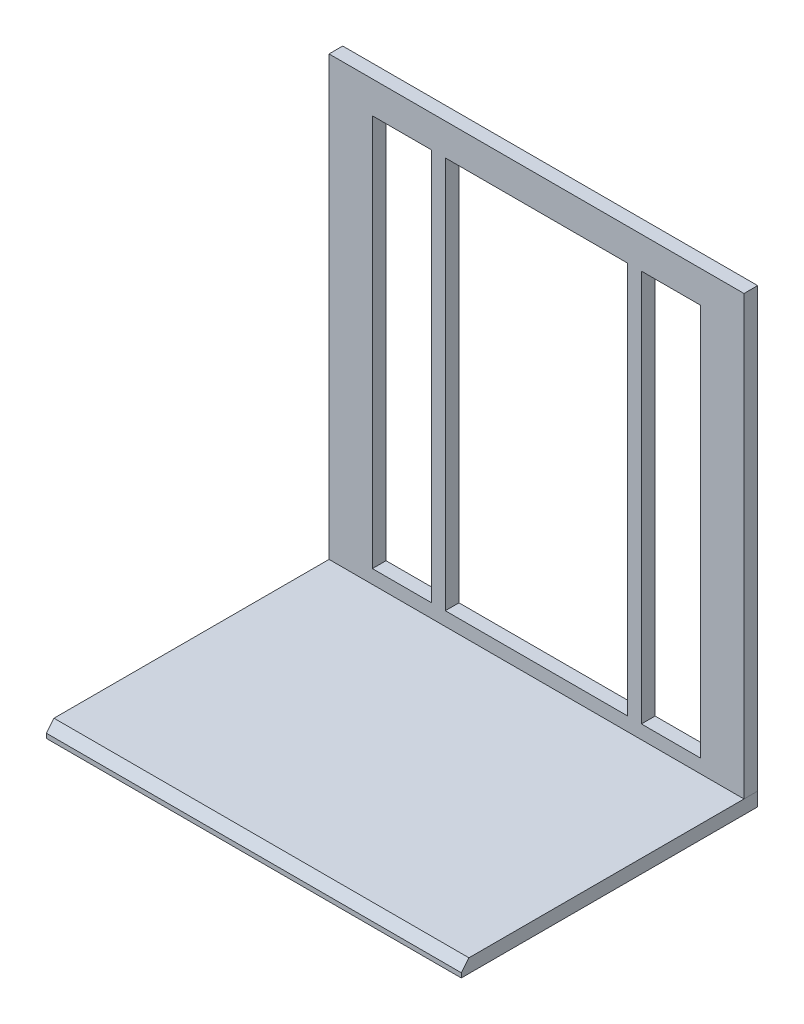
ISO-10303-21;
HEADER;
FILE_DESCRIPTION(('STEP AP214'),'2;1');
FILE_NAME('part.step','',(''),(''),'','','');
FILE_SCHEMA(('AUTOMOTIVE_DESIGN { 1 0 10303 214 1 1 1 1 }'));
ENDSEC;
DATA;
#1=APPLICATION_CONTEXT('core data for automotive mechanical design processes');
#2=APPLICATION_PROTOCOL_DEFINITION('international standard','automotive_design',2000,#1);
#3=PRODUCT_CONTEXT('',#1,'mechanical');
#4=PRODUCT('Part','Part','',(#3));
#5=PRODUCT_RELATED_PRODUCT_CATEGORY('part','',(#4));
#6=PRODUCT_DEFINITION_FORMATION('','',#4);
#7=PRODUCT_DEFINITION_CONTEXT('part definition',#1,'design');
#8=PRODUCT_DEFINITION('design','',#6,#7);
#9=PRODUCT_DEFINITION_SHAPE('','',#8);
#10=(LENGTH_UNIT() NAMED_UNIT(*) SI_UNIT(.MILLI.,.METRE.));
#11=(NAMED_UNIT(*) PLANE_ANGLE_UNIT() SI_UNIT($,.RADIAN.));
#12=(NAMED_UNIT(*) SI_UNIT($,.STERADIAN.) SOLID_ANGLE_UNIT());
#13=UNCERTAINTY_MEASURE_WITH_UNIT(LENGTH_MEASURE(1.E-05),#10,'distance_accuracy_value','');
#14=(GEOMETRIC_REPRESENTATION_CONTEXT(3) GLOBAL_UNCERTAINTY_ASSIGNED_CONTEXT((#13)) GLOBAL_UNIT_ASSIGNED_CONTEXT((#10,
#11,#12)) REPRESENTATION_CONTEXT('',''));
#15=CARTESIAN_POINT('',(0.,0.,0.));
#16=DIRECTION('',(0.,0.,1.));
#17=DIRECTION('',(1.,0.,0.));
#18=AXIS2_PLACEMENT_3D('',#15,#16,#17);
#19=CARTESIAN_POINT('',(-1155.7,-1168.4,1651.));
#20=DIRECTION('',(-1.,0.,0.));
#21=DIRECTION('',(0.,0.,1.));
#22=AXIS2_PLACEMENT_3D('',#19,#20,#21);
#23=PLANE('',#22);
#24=DIRECTION('',(0.,1.,0.));
#25=VECTOR('',#24,1.);
#26=CARTESIAN_POINT('',(-1155.7,-1168.4,1651.));
#27=LINE('',#26,#25);
#28=CARTESIAN_POINT('',(-1155.7,-1244.6,1651.));
#29=VERTEX_POINT('',#28);
#30=CARTESIAN_POINT('',(-1155.7,-1219.2,1651.));
#31=VERTEX_POINT('',#30);
#32=EDGE_CURVE('E98',#29,#31,#27,.T.);
#33=ORIENTED_EDGE('',*,*,#32,.T.);
#34=DIRECTION('',(0.,-0.766044443118982,0.642787609686535));
#35=VECTOR('',#34,1.);
#36=CARTESIAN_POINT('',(-1155.7,-1189.38933628726,1625.98588307349));
#37=LINE('',#36,#35);
#38=CARTESIAN_POINT('',(-1155.7,-1168.4,1608.37373873619));
#39=VERTEX_POINT('',#38);
#40=EDGE_CURVE('E12',#31,#39,#37,.F.);
#41=ORIENTED_EDGE('',*,*,#40,.T.);
#42=DIRECTION('',(0.,0.,-1.));
#43=VECTOR('',#42,1.);
#44=CARTESIAN_POINT('',(-1155.7,-1168.4,1651.));
#45=LINE('',#44,#43);
#46=CARTESIAN_POINT('',(-1155.7,-1168.4,0.));
#47=VERTEX_POINT('',#46);
#48=EDGE_CURVE('E110',#39,#47,#45,.T.);
#49=ORIENTED_EDGE('',*,*,#48,.T.);
#50=DIRECTION('',(0.,1.,0.));
#51=VECTOR('',#50,1.);
#52=CARTESIAN_POINT('',(-1155.7,-1168.4,0.));
#53=LINE('',#52,#51);
#54=CARTESIAN_POINT('',(-1155.7,-1244.6,0.));
#55=VERTEX_POINT('',#54);
#56=EDGE_CURVE('E115',#55,#47,#53,.T.);
#57=ORIENTED_EDGE('',*,*,#56,.F.);
#58=DIRECTION('',(0.,0.,-1.));
#59=VECTOR('',#58,1.);
#60=CARTESIAN_POINT('',(-1155.7,-1244.6,1651.));
#61=LINE('',#60,#59);
#62=EDGE_CURVE('E106',#29,#55,#61,.T.);
#63=ORIENTED_EDGE('',*,*,#62,.F.);
#64=EDGE_LOOP('',(#33,#41,#49,#57,#63));
#65=FACE_BOUND('',#64,.T.);
#66=ADVANCED_FACE('F47',(#65),#23,.T.);
#67=CARTESIAN_POINT('',(-1155.7,-1244.6,1651.));
#68=DIRECTION('',(0.,-1.,0.));
#69=DIRECTION('',(1.,0.,0.));
#70=AXIS2_PLACEMENT_3D('',#67,#68,#69);
#71=PLANE('',#70);
#72=DIRECTION('',(-1.,0.,0.));
#73=VECTOR('',#72,1.);
#74=CARTESIAN_POINT('',(-1155.7,-1244.6,0.));
#75=LINE('',#74,#73);
#76=CARTESIAN_POINT('',(1155.7,-1244.6,0.));
#77=VERTEX_POINT('',#76);
#78=EDGE_CURVE('E105',#77,#55,#75,.T.);
#79=ORIENTED_EDGE('',*,*,#78,.F.);
#80=DIRECTION('',(0.,0.,-1.));
#81=VECTOR('',#80,1.);
#82=CARTESIAN_POINT('',(1155.7,-1244.6,1651.));
#83=LINE('',#82,#81);
#84=CARTESIAN_POINT('',(1155.7,-1244.6,1651.));
#85=VERTEX_POINT('',#84);
#86=EDGE_CURVE('E94',#85,#77,#83,.T.);
#87=ORIENTED_EDGE('',*,*,#86,.F.);
#88=DIRECTION('',(-1.,0.,0.));
#89=VECTOR('',#88,1.);
#90=CARTESIAN_POINT('',(-1155.7,-1244.6,1651.));
#91=LINE('',#90,#89);
#92=EDGE_CURVE('E97',#85,#29,#91,.T.);
#93=ORIENTED_EDGE('',*,*,#92,.T.);
#94=ORIENTED_EDGE('',*,*,#62,.T.);
#95=EDGE_LOOP('',(#79,#87,#93,#94));
#96=FACE_BOUND('',#95,.T.);
#97=ADVANCED_FACE('F103',(#96),#71,.T.);
#98=CARTESIAN_POINT('',(1155.7,-1168.4,1651.));
#99=DIRECTION('',(1.,0.,0.));
#100=DIRECTION('',(0.,0.,-1.));
#101=AXIS2_PLACEMENT_3D('',#98,#99,#100);
#102=PLANE('',#101);
#103=DIRECTION('',(0.,0.,-1.));
#104=VECTOR('',#103,1.);
#105=CARTESIAN_POINT('',(1155.7,-1168.4,1651.));
#106=LINE('',#105,#104);
#107=CARTESIAN_POINT('',(1155.7,-1168.4,1608.37373873619));
#108=VERTEX_POINT('',#107);
#109=CARTESIAN_POINT('',(1155.7,-1168.4,0.));
#110=VERTEX_POINT('',#109);
#111=EDGE_CURVE('E107',#108,#110,#106,.T.);
#112=ORIENTED_EDGE('',*,*,#111,.F.);
#113=DIRECTION('',(0.,0.766044443118982,-0.642787609686535));
#114=VECTOR('',#113,1.);
#115=CARTESIAN_POINT('',(1155.7,-1189.38933628726,1625.98588307349));
#116=LINE('',#115,#114);
#117=CARTESIAN_POINT('',(1155.7,-1219.2,1651.));
#118=VERTEX_POINT('',#117);
#119=EDGE_CURVE('E69',#108,#118,#116,.F.);
#120=ORIENTED_EDGE('',*,*,#119,.T.);
#121=DIRECTION('',(0.,-1.,0.));
#122=VECTOR('',#121,1.);
#123=CARTESIAN_POINT('',(1155.7,-1168.4,1651.));
#124=LINE('',#123,#122);
#125=EDGE_CURVE('E90',#118,#85,#124,.T.);
#126=ORIENTED_EDGE('',*,*,#125,.T.);
#127=ORIENTED_EDGE('',*,*,#86,.T.);
#128=DIRECTION('',(0.,-1.,0.));
#129=VECTOR('',#128,1.);
#130=CARTESIAN_POINT('',(1155.7,-1168.4,0.));
#131=LINE('',#130,#129);
#132=EDGE_CURVE('E121',#110,#77,#131,.T.);
#133=ORIENTED_EDGE('',*,*,#132,.F.);
#134=EDGE_LOOP('',(#112,#120,#126,#127,#133));
#135=FACE_BOUND('',#134,.T.);
#136=ADVANCED_FACE('F92',(#135),#102,.T.);
#137=CARTESIAN_POINT('',(-1155.7,-1168.4,1651.));
#138=DIRECTION('',(0.,1.,0.));
#139=DIRECTION('',(-1.,0.,0.));
#140=AXIS2_PLACEMENT_3D('',#137,#138,#139);
#141=PLANE('',#140);
#142=ORIENTED_EDGE('',*,*,#48,.F.);
#143=DIRECTION('',(1.,0.,0.));
#144=VECTOR('',#143,1.);
#145=CARTESIAN_POINT('',(-1155.7,-1168.4,1608.37373873619));
#146=LINE('',#145,#144);
#147=EDGE_CURVE('E124',#39,#108,#146,.T.);
#148=ORIENTED_EDGE('',*,*,#147,.T.);
#149=ORIENTED_EDGE('',*,*,#111,.T.);
#150=DIRECTION('',(1.,0.,0.));
#151=VECTOR('',#150,1.);
#152=CARTESIAN_POINT('',(-1155.7,-1168.4,0.));
#153=LINE('',#152,#151);
#154=EDGE_CURVE('E118',#47,#110,#153,.T.);
#155=ORIENTED_EDGE('',*,*,#154,.F.);
#156=EDGE_LOOP('',(#142,#148,#149,#155));
#157=FACE_BOUND('',#156,.T.);
#158=ADVANCED_FACE('F132',(#157),#141,.T.);
#159=CARTESIAN_POINT('',(0.,0.,1651.));
#160=DIRECTION('',(0.,0.,1.));
#161=DIRECTION('',(1.,0.,0.));
#162=AXIS2_PLACEMENT_3D('',#159,#160,#161);
#163=PLANE('',#162);
#164=ORIENTED_EDGE('',*,*,#125,.F.);
#165=DIRECTION('',(-1.,0.,0.));
#166=VECTOR('',#165,1.);
#167=CARTESIAN_POINT('',(-1.17122428971445E-13,-1219.2,1651.));
#168=LINE('',#167,#166);
#169=EDGE_CURVE('E55',#118,#31,#168,.T.);
#170=ORIENTED_EDGE('',*,*,#169,.T.);
#171=ORIENTED_EDGE('',*,*,#32,.F.);
#172=ORIENTED_EDGE('',*,*,#92,.F.);
#173=EDGE_LOOP('',(#164,#170,#171,#172));
#174=FACE_BOUND('',#173,.T.);
#175=ADVANCED_FACE('F109',(#174),#163,.T.);
#176=CARTESIAN_POINT('',(0.,0.,0.));
#177=DIRECTION('',(0.,0.,1.));
#178=DIRECTION('',(1.,0.,0.));
#179=AXIS2_PLACEMENT_3D('',#176,#177,#178);
#180=PLANE('',#179);
#181=ORIENTED_EDGE('',*,*,#56,.T.);
#182=ORIENTED_EDGE('',*,*,#154,.T.);
#183=ORIENTED_EDGE('',*,*,#132,.T.);
#184=ORIENTED_EDGE('',*,*,#78,.T.);
#185=EDGE_LOOP('',(#181,#182,#183,#184));
#186=FACE_BOUND('',#185,.T.);
#187=ADVANCED_FACE('F137',(#186),#180,.F.);
#188=CARTESIAN_POINT('',(-1155.7,-1168.4,1608.37373873619));
#189=DIRECTION('',(0.,-0.642787609686535,-0.766044443118982));
#190=DIRECTION('',(1.,0.,0.));
#191=AXIS2_PLACEMENT_3D('',#188,#189,#190);
#192=PLANE('',#191);
#193=ORIENTED_EDGE('',*,*,#40,.F.);
#194=ORIENTED_EDGE('',*,*,#169,.F.);
#195=ORIENTED_EDGE('',*,*,#119,.F.);
#196=ORIENTED_EDGE('',*,*,#147,.F.);
#197=EDGE_LOOP('',(#193,#194,#195,#196));
#198=FACE_BOUND('',#197,.T.);
#199=ADVANCED_FACE('F49',(#198),#192,.F.);
#200=CLOSED_SHELL('',(#66,#97,#136,#158,#175,#187,#199));
#201=MANIFOLD_SOLID_BREP('B2',#200);
#202=CARTESIAN_POINT('',(0.,0.,76.2));
#203=DIRECTION('',(0.,0.,1.));
#204=DIRECTION('',(1.,0.,0.));
#205=AXIS2_PLACEMENT_3D('',#202,#203,#204);
#206=PLANE('',#205);
#207=DIRECTION('',(0.,1.,0.));
#208=VECTOR('',#207,1.);
#209=CARTESIAN_POINT('',(1155.7,1270.,76.2));
#210=LINE('',#209,#208);
#211=CARTESIAN_POINT('',(1155.7,-1168.4,76.2));
#212=VERTEX_POINT('',#211);
#213=CARTESIAN_POINT('',(1155.7,1270.,76.2));
#214=VERTEX_POINT('',#213);
#215=EDGE_CURVE('E408',#212,#214,#210,.T.);
#216=ORIENTED_EDGE('',*,*,#215,.T.);
#217=DIRECTION('',(-1.,0.,0.));
#218=VECTOR('',#217,1.);
#219=CARTESIAN_POINT('',(-1155.7,1270.,76.2));
#220=LINE('',#219,#218);
#221=CARTESIAN_POINT('',(-1155.7,1270.,76.2));
#222=VERTEX_POINT('',#221);
#223=EDGE_CURVE('E411',#214,#222,#220,.T.);
#224=ORIENTED_EDGE('',*,*,#223,.T.);
#225=DIRECTION('',(0.,-1.,0.));
#226=VECTOR('',#225,1.);
#227=CARTESIAN_POINT('',(-1155.7,1270.,76.2));
#228=LINE('',#227,#226);
#229=CARTESIAN_POINT('',(-1155.7,-1168.4,76.2));
#230=VERTEX_POINT('',#229);
#231=EDGE_CURVE('E414',#222,#230,#228,.T.);
#232=ORIENTED_EDGE('',*,*,#231,.T.);
#233=DIRECTION('',(1.,0.,0.));
#234=VECTOR('',#233,1.);
#235=CARTESIAN_POINT('',(-1155.7,-1168.4,76.2));
#236=LINE('',#235,#234);
#237=EDGE_CURVE('E416',#230,#212,#236,.T.);
#238=ORIENTED_EDGE('',*,*,#237,.T.);
#239=EDGE_LOOP('',(#216,#224,#232,#238));
#240=FACE_BOUND('',#239,.T.);
#241=DIRECTION('',(-1.,0.,0.));
#242=VECTOR('',#241,1.);
#243=CARTESIAN_POINT('',(-508.,1092.2,76.2));
#244=LINE('',#243,#242);
#245=CARTESIAN_POINT('',(508.,1092.2,76.2));
#246=VERTEX_POINT('',#245);
#247=CARTESIAN_POINT('',(-508.,1092.2,76.2));
#248=VERTEX_POINT('',#247);
#249=EDGE_CURVE('E379',#246,#248,#244,.T.);
#250=ORIENTED_EDGE('',*,*,#249,.F.);
#251=DIRECTION('',(0.,1.,0.));
#252=VECTOR('',#251,1.);
#253=CARTESIAN_POINT('',(508.,1092.2,76.2));
#254=LINE('',#253,#252);
#255=CARTESIAN_POINT('',(508.000000000001,-1092.2,76.2));
#256=VERTEX_POINT('',#255);
#257=EDGE_CURVE('E377',#256,#246,#254,.T.);
#258=ORIENTED_EDGE('',*,*,#257,.F.);
#259=DIRECTION('',(1.,0.,0.));
#260=VECTOR('',#259,1.);
#261=CARTESIAN_POINT('',(-508.,-1092.2,76.2));
#262=LINE('',#261,#260);
#263=CARTESIAN_POINT('',(-508.,-1092.2,76.2));
#264=VERTEX_POINT('',#263);
#265=EDGE_CURVE('E385',#264,#256,#262,.T.);
#266=ORIENTED_EDGE('',*,*,#265,.F.);
#267=DIRECTION('',(0.,-1.,0.));
#268=VECTOR('',#267,1.);
#269=CARTESIAN_POINT('',(-508.,1092.2,76.2));
#270=LINE('',#269,#268);
#271=EDGE_CURVE('E382',#248,#264,#270,.T.);
#272=ORIENTED_EDGE('',*,*,#271,.F.);
#273=EDGE_LOOP('',(#250,#258,#266,#272));
#274=FACE_BOUND('',#273,.T.);
#275=DIRECTION('',(1.,0.,0.));
#276=VECTOR('',#275,1.);
#277=CARTESIAN_POINT('',(-914.4,-1092.2,76.2));
#278=LINE('',#277,#276);
#279=CARTESIAN_POINT('',(-914.4,-1092.2,76.2));
#280=VERTEX_POINT('',#279);
#281=CARTESIAN_POINT('',(-584.2,-1092.2,76.2));
#282=VERTEX_POINT('',#281);
#283=EDGE_CURVE('E348',#280,#282,#278,.T.);
#284=ORIENTED_EDGE('',*,*,#283,.F.);
#285=DIRECTION('',(0.,-1.,0.));
#286=VECTOR('',#285,1.);
#287=CARTESIAN_POINT('',(-914.4,1092.2,76.2));
#288=LINE('',#287,#286);
#289=CARTESIAN_POINT('',(-914.4,1092.2,76.2));
#290=VERTEX_POINT('',#289);
#291=EDGE_CURVE('E346',#290,#280,#288,.T.);
#292=ORIENTED_EDGE('',*,*,#291,.F.);
#293=DIRECTION('',(-1.,0.,0.));
#294=VECTOR('',#293,1.);
#295=CARTESIAN_POINT('',(-914.4,1092.2,76.2));
#296=LINE('',#295,#294);
#297=CARTESIAN_POINT('',(-584.2,1092.2,76.2));
#298=VERTEX_POINT('',#297);
#299=EDGE_CURVE('E354',#298,#290,#296,.T.);
#300=ORIENTED_EDGE('',*,*,#299,.F.);
#301=DIRECTION('',(0.,1.,0.));
#302=VECTOR('',#301,1.);
#303=CARTESIAN_POINT('',(-584.2,1092.2,76.2));
#304=LINE('',#303,#302);
#305=EDGE_CURVE('E351',#282,#298,#304,.T.);
#306=ORIENTED_EDGE('',*,*,#305,.F.);
#307=EDGE_LOOP('',(#284,#292,#300,#306));
#308=FACE_BOUND('',#307,.T.);
#309=DIRECTION('',(-1.,0.,0.));
#310=VECTOR('',#309,1.);
#311=CARTESIAN_POINT('',(914.4,1092.2,76.2));
#312=LINE('',#311,#310);
#313=CARTESIAN_POINT('',(914.4,1092.2,76.2));
#314=VERTEX_POINT('',#313);
#315=CARTESIAN_POINT('',(584.2,1092.2,76.2));
#316=VERTEX_POINT('',#315);
#317=EDGE_CURVE('E318',#314,#316,#312,.T.);
#318=ORIENTED_EDGE('',*,*,#317,.F.);
#319=DIRECTION('',(0.,1.,0.));
#320=VECTOR('',#319,1.);
#321=CARTESIAN_POINT('',(914.4,1092.2,76.2));
#322=LINE('',#321,#320);
#323=CARTESIAN_POINT('',(914.4,-1092.2,76.2));
#324=VERTEX_POINT('',#323);
#325=EDGE_CURVE('E310',#324,#314,#322,.T.);
#326=ORIENTED_EDGE('',*,*,#325,.F.);
#327=DIRECTION('',(1.,0.,0.));
#328=VECTOR('',#327,1.);
#329=CARTESIAN_POINT('',(914.4,-1092.2,76.2));
#330=LINE('',#329,#328);
#331=CARTESIAN_POINT('',(584.2,-1092.2,76.2));
#332=VERTEX_POINT('',#331);
#333=EDGE_CURVE('E332',#332,#324,#330,.T.);
#334=ORIENTED_EDGE('',*,*,#333,.F.);
#335=DIRECTION('',(0.,-1.,0.));
#336=VECTOR('',#335,1.);
#337=CARTESIAN_POINT('',(584.2,1092.2,76.2));
#338=LINE('',#337,#336);
#339=EDGE_CURVE('E330',#316,#332,#338,.T.);
#340=ORIENTED_EDGE('',*,*,#339,.F.);
#341=EDGE_LOOP('',(#318,#326,#334,#340));
#342=FACE_BOUND('',#341,.T.);
#343=ADVANCED_FACE('F197',(#240,#274,#308,#342),#206,.T.);
#344=CARTESIAN_POINT('',(0.,0.,0.));
#345=DIRECTION('',(0.,0.,1.));
#346=DIRECTION('',(1.,0.,0.));
#347=AXIS2_PLACEMENT_3D('',#344,#345,#346);
#348=PLANE('',#347);
#349=DIRECTION('',(0.,-1.,0.));
#350=VECTOR('',#349,1.);
#351=CARTESIAN_POINT('',(-914.4,1092.2,0.));
#352=LINE('',#351,#350);
#353=CARTESIAN_POINT('',(-914.4,1092.2,0.));
#354=VERTEX_POINT('',#353);
#355=CARTESIAN_POINT('',(-914.4,-1092.2,0.));
#356=VERTEX_POINT('',#355);
#357=EDGE_CURVE('E326',#354,#356,#352,.T.);
#358=ORIENTED_EDGE('',*,*,#357,.T.);
#359=DIRECTION('',(1.,0.,0.));
#360=VECTOR('',#359,1.);
#361=CARTESIAN_POINT('',(-914.4,-1092.2,0.));
#362=LINE('',#361,#360);
#363=CARTESIAN_POINT('',(-584.2,-1092.2,0.));
#364=VERTEX_POINT('',#363);
#365=EDGE_CURVE('E359',#356,#364,#362,.T.);
#366=ORIENTED_EDGE('',*,*,#365,.T.);
#367=DIRECTION('',(0.,1.,0.));
#368=VECTOR('',#367,1.);
#369=CARTESIAN_POINT('',(-584.2,1092.2,0.));
#370=LINE('',#369,#368);
#371=CARTESIAN_POINT('',(-584.2,1092.2,0.));
#372=VERTEX_POINT('',#371);
#373=EDGE_CURVE('E362',#364,#372,#370,.T.);
#374=ORIENTED_EDGE('',*,*,#373,.T.);
#375=DIRECTION('',(-1.,0.,0.));
#376=VECTOR('',#375,1.);
#377=CARTESIAN_POINT('',(-914.4,1092.2,0.));
#378=LINE('',#377,#376);
#379=EDGE_CURVE('E349',#372,#354,#378,.T.);
#380=ORIENTED_EDGE('',*,*,#379,.T.);
#381=EDGE_LOOP('',(#358,#366,#374,#380));
#382=FACE_BOUND('',#381,.T.);
#383=DIRECTION('',(0.,1.,0.));
#384=VECTOR('',#383,1.);
#385=CARTESIAN_POINT('',(1155.7,1270.,0.));
#386=LINE('',#385,#384);
#387=CARTESIAN_POINT('',(1155.7,-1168.4,0.));
#388=VERTEX_POINT('',#387);
#389=CARTESIAN_POINT('',(1155.7,1270.,0.));
#390=VERTEX_POINT('',#389);
#391=EDGE_CURVE('E407',#388,#390,#386,.T.);
#392=ORIENTED_EDGE('',*,*,#391,.F.);
#393=DIRECTION('',(1.,0.,0.));
#394=VECTOR('',#393,1.);
#395=CARTESIAN_POINT('',(-1155.7,-1168.4,0.));
#396=LINE('',#395,#394);
#397=CARTESIAN_POINT('',(-1155.7,-1168.4,0.));
#398=VERTEX_POINT('',#397);
#399=EDGE_CURVE('E412',#398,#388,#396,.T.);
#400=ORIENTED_EDGE('',*,*,#399,.F.);
#401=DIRECTION('',(0.,-1.,0.));
#402=VECTOR('',#401,1.);
#403=CARTESIAN_POINT('',(-1155.7,1270.,0.));
#404=LINE('',#403,#402);
#405=CARTESIAN_POINT('',(-1155.7,1270.,0.));
#406=VERTEX_POINT('',#405);
#407=EDGE_CURVE('E423',#406,#398,#404,.T.);
#408=ORIENTED_EDGE('',*,*,#407,.F.);
#409=DIRECTION('',(-1.,0.,0.));
#410=VECTOR('',#409,1.);
#411=CARTESIAN_POINT('',(-1155.7,1270.,0.));
#412=LINE('',#411,#410);
#413=EDGE_CURVE('E421',#390,#406,#412,.T.);
#414=ORIENTED_EDGE('',*,*,#413,.F.);
#415=EDGE_LOOP('',(#392,#400,#408,#414));
#416=FACE_BOUND('',#415,.T.);
#417=DIRECTION('',(0.,1.,0.));
#418=VECTOR('',#417,1.);
#419=CARTESIAN_POINT('',(508.,1092.2,0.));
#420=LINE('',#419,#418);
#421=CARTESIAN_POINT('',(508.000000000001,-1092.2,0.));
#422=VERTEX_POINT('',#421);
#423=CARTESIAN_POINT('',(508.,1092.2,0.));
#424=VERTEX_POINT('',#423);
#425=EDGE_CURVE('E376',#422,#424,#420,.T.);
#426=ORIENTED_EDGE('',*,*,#425,.T.);
#427=DIRECTION('',(-1.,0.,0.));
#428=VECTOR('',#427,1.);
#429=CARTESIAN_POINT('',(-508.,1092.2,0.));
#430=LINE('',#429,#428);
#431=CARTESIAN_POINT('',(-508.,1092.2,0.));
#432=VERTEX_POINT('',#431);
#433=EDGE_CURVE('E390',#424,#432,#430,.T.);
#434=ORIENTED_EDGE('',*,*,#433,.T.);
#435=DIRECTION('',(0.,-1.,0.));
#436=VECTOR('',#435,1.);
#437=CARTESIAN_POINT('',(-508.,1092.2,0.));
#438=LINE('',#437,#436);
#439=CARTESIAN_POINT('',(-508.,-1092.2,0.));
#440=VERTEX_POINT('',#439);
#441=EDGE_CURVE('E393',#432,#440,#438,.T.);
#442=ORIENTED_EDGE('',*,*,#441,.T.);
#443=DIRECTION('',(1.,0.,0.));
#444=VECTOR('',#443,1.);
#445=CARTESIAN_POINT('',(-508.,-1092.2,0.));
#446=LINE('',#445,#444);
#447=EDGE_CURVE('E380',#440,#422,#446,.T.);
#448=ORIENTED_EDGE('',*,*,#447,.T.);
#449=EDGE_LOOP('',(#426,#434,#442,#448));
#450=FACE_BOUND('',#449,.T.);
#451=DIRECTION('',(0.,1.,0.));
#452=VECTOR('',#451,1.);
#453=CARTESIAN_POINT('',(914.4,1092.2,0.));
#454=LINE('',#453,#452);
#455=CARTESIAN_POINT('',(914.4,-1092.2,0.));
#456=VERTEX_POINT('',#455);
#457=CARTESIAN_POINT('',(914.4,1092.2,0.));
#458=VERTEX_POINT('',#457);
#459=EDGE_CURVE('E220',#456,#458,#454,.T.);
#460=ORIENTED_EDGE('',*,*,#459,.T.);
#461=DIRECTION('',(-1.,0.,0.));
#462=VECTOR('',#461,1.);
#463=CARTESIAN_POINT('',(914.4,1092.2,0.));
#464=LINE('',#463,#462);
#465=CARTESIAN_POINT('',(584.2,1092.2,0.));
#466=VERTEX_POINT('',#465);
#467=EDGE_CURVE('E325',#458,#466,#464,.T.);
#468=ORIENTED_EDGE('',*,*,#467,.T.);
#469=DIRECTION('',(0.,-1.,0.));
#470=VECTOR('',#469,1.);
#471=CARTESIAN_POINT('',(584.2,1092.2,0.));
#472=LINE('',#471,#470);
#473=CARTESIAN_POINT('',(584.2,-1092.2,0.));
#474=VERTEX_POINT('',#473);
#475=EDGE_CURVE('E338',#466,#474,#472,.T.);
#476=ORIENTED_EDGE('',*,*,#475,.T.);
#477=DIRECTION('',(1.,0.,0.));
#478=VECTOR('',#477,1.);
#479=CARTESIAN_POINT('',(914.4,-1092.2,0.));
#480=LINE('',#479,#478);
#481=EDGE_CURVE('E319',#474,#456,#480,.T.);
#482=ORIENTED_EDGE('',*,*,#481,.T.);
#483=EDGE_LOOP('',(#460,#468,#476,#482));
#484=FACE_BOUND('',#483,.T.);
#485=ADVANCED_FACE('F441',(#382,#416,#450,#484),#348,.F.);
#486=CARTESIAN_POINT('',(1155.7,1270.,76.2));
#487=DIRECTION('',(-1.,0.,0.));
#488=DIRECTION('',(0.,-1.,0.));
#489=AXIS2_PLACEMENT_3D('',#486,#487,#488);
#490=PLANE('',#489);
#491=ORIENTED_EDGE('',*,*,#391,.T.);
#492=DIRECTION('',(0.,0.,-1.));
#493=VECTOR('',#492,1.);
#494=CARTESIAN_POINT('',(1155.7,1270.,76.2));
#495=LINE('',#494,#493);
#496=EDGE_CURVE('E45',#214,#390,#495,.T.);
#497=ORIENTED_EDGE('',*,*,#496,.F.);
#498=ORIENTED_EDGE('',*,*,#215,.F.);
#499=DIRECTION('',(0.,0.,-1.));
#500=VECTOR('',#499,1.);
#501=CARTESIAN_POINT('',(1155.7,-1168.4,76.2));
#502=LINE('',#501,#500);
#503=EDGE_CURVE('E418',#212,#388,#502,.T.);
#504=ORIENTED_EDGE('',*,*,#503,.T.);
#505=EDGE_LOOP('',(#491,#497,#498,#504));
#506=FACE_BOUND('',#505,.T.);
#507=ADVANCED_FACE('F199',(#506),#490,.F.);
#508=CARTESIAN_POINT('',(-1155.7,1270.,76.2));
#509=DIRECTION('',(0.,-1.,0.));
#510=DIRECTION('',(0.,0.,-1.));
#511=AXIS2_PLACEMENT_3D('',#508,#509,#510);
#512=PLANE('',#511);
#513=ORIENTED_EDGE('',*,*,#413,.T.);
#514=DIRECTION('',(0.,0.,-1.));
#515=VECTOR('',#514,1.);
#516=CARTESIAN_POINT('',(-1155.7,1270.,76.2));
#517=LINE('',#516,#515);
#518=EDGE_CURVE('E205',#222,#406,#517,.T.);
#519=ORIENTED_EDGE('',*,*,#518,.F.);
#520=ORIENTED_EDGE('',*,*,#223,.F.);
#521=ORIENTED_EDGE('',*,*,#496,.T.);
#522=EDGE_LOOP('',(#513,#519,#520,#521));
#523=FACE_BOUND('',#522,.T.);
#524=ADVANCED_FACE('F452',(#523),#512,.F.);
#525=CARTESIAN_POINT('',(-1155.7,1270.,76.2));
#526=DIRECTION('',(1.,0.,0.));
#527=DIRECTION('',(0.,1.,0.));
#528=AXIS2_PLACEMENT_3D('',#525,#526,#527);
#529=PLANE('',#528);
#530=ORIENTED_EDGE('',*,*,#407,.T.);
#531=DIRECTION('',(0.,0.,-1.));
#532=VECTOR('',#531,1.);
#533=CARTESIAN_POINT('',(-1155.7,-1168.4,76.2));
#534=LINE('',#533,#532);
#535=EDGE_CURVE('E428',#230,#398,#534,.T.);
#536=ORIENTED_EDGE('',*,*,#535,.F.);
#537=ORIENTED_EDGE('',*,*,#231,.F.);
#538=ORIENTED_EDGE('',*,*,#518,.T.);
#539=EDGE_LOOP('',(#530,#536,#537,#538));
#540=FACE_BOUND('',#539,.T.);
#541=ADVANCED_FACE('F435',(#540),#529,.F.);
#542=CARTESIAN_POINT('',(-1155.7,-1168.4,76.2));
#543=DIRECTION('',(0.,1.,0.));
#544=DIRECTION('',(0.,0.,1.));
#545=AXIS2_PLACEMENT_3D('',#542,#543,#544);
#546=PLANE('',#545);
#547=ORIENTED_EDGE('',*,*,#399,.T.);
#548=ORIENTED_EDGE('',*,*,#503,.F.);
#549=ORIENTED_EDGE('',*,*,#237,.F.);
#550=ORIENTED_EDGE('',*,*,#535,.T.);
#551=EDGE_LOOP('',(#547,#548,#549,#550));
#552=FACE_BOUND('',#551,.T.);
#553=ADVANCED_FACE('F445',(#552),#546,.F.);
#554=CARTESIAN_POINT('',(508.,1092.2,76.2));
#555=DIRECTION('',(-1.,0.,0.));
#556=DIRECTION('',(0.,-1.,0.));
#557=AXIS2_PLACEMENT_3D('',#554,#555,#556);
#558=PLANE('',#557);
#559=ORIENTED_EDGE('',*,*,#425,.F.);
#560=DIRECTION('',(0.,0.,-1.));
#561=VECTOR('',#560,1.);
#562=CARTESIAN_POINT('',(508.000000000001,-1092.2,76.2));
#563=LINE('',#562,#561);
#564=EDGE_CURVE('E387',#256,#422,#563,.T.);
#565=ORIENTED_EDGE('',*,*,#564,.F.);
#566=ORIENTED_EDGE('',*,*,#257,.T.);
#567=DIRECTION('',(0.,0.,-1.));
#568=VECTOR('',#567,1.);
#569=CARTESIAN_POINT('',(508.,1092.2,76.2));
#570=LINE('',#569,#568);
#571=EDGE_CURVE('E404',#246,#424,#570,.T.);
#572=ORIENTED_EDGE('',*,*,#571,.T.);
#573=EDGE_LOOP('',(#559,#565,#566,#572));
#574=FACE_BOUND('',#573,.T.);
#575=ADVANCED_FACE('F467',(#574),#558,.T.);
#576=CARTESIAN_POINT('',(-508.,1092.2,76.2));
#577=DIRECTION('',(0.,-1.,0.));
#578=DIRECTION('',(1.,0.,0.));
#579=AXIS2_PLACEMENT_3D('',#576,#577,#578);
#580=PLANE('',#579);
#581=ORIENTED_EDGE('',*,*,#433,.F.);
#582=ORIENTED_EDGE('',*,*,#571,.F.);
#583=ORIENTED_EDGE('',*,*,#249,.T.);
#584=DIRECTION('',(0.,0.,-1.));
#585=VECTOR('',#584,1.);
#586=CARTESIAN_POINT('',(-508.,1092.2,76.2));
#587=LINE('',#586,#585);
#588=EDGE_CURVE('E402',#248,#432,#587,.T.);
#589=ORIENTED_EDGE('',*,*,#588,.T.);
#590=EDGE_LOOP('',(#581,#582,#583,#589));
#591=FACE_BOUND('',#590,.T.);
#592=ADVANCED_FACE('F474',(#591),#580,.T.);
#593=CARTESIAN_POINT('',(-508.,1092.2,76.2));
#594=DIRECTION('',(1.,0.,0.));
#595=DIRECTION('',(0.,1.,0.));
#596=AXIS2_PLACEMENT_3D('',#593,#594,#595);
#597=PLANE('',#596);
#598=ORIENTED_EDGE('',*,*,#441,.F.);
#599=ORIENTED_EDGE('',*,*,#588,.F.);
#600=ORIENTED_EDGE('',*,*,#271,.T.);
#601=DIRECTION('',(0.,0.,-1.));
#602=VECTOR('',#601,1.);
#603=CARTESIAN_POINT('',(-508.,-1092.2,76.2));
#604=LINE('',#603,#602);
#605=EDGE_CURVE('E400',#264,#440,#604,.T.);
#606=ORIENTED_EDGE('',*,*,#605,.T.);
#607=EDGE_LOOP('',(#598,#599,#600,#606));
#608=FACE_BOUND('',#607,.T.);
#609=ADVANCED_FACE('F479',(#608),#597,.T.);
#610=CARTESIAN_POINT('',(-508.,-1092.2,76.2));
#611=DIRECTION('',(0.,1.,0.));
#612=DIRECTION('',(-1.,0.,0.));
#613=AXIS2_PLACEMENT_3D('',#610,#611,#612);
#614=PLANE('',#613);
#615=ORIENTED_EDGE('',*,*,#447,.F.);
#616=ORIENTED_EDGE('',*,*,#605,.F.);
#617=ORIENTED_EDGE('',*,*,#265,.T.);
#618=ORIENTED_EDGE('',*,*,#564,.T.);
#619=EDGE_LOOP('',(#615,#616,#617,#618));
#620=FACE_BOUND('',#619,.T.);
#621=ADVANCED_FACE('F486',(#620),#614,.T.);
#622=CARTESIAN_POINT('',(-914.4,1092.2,76.2));
#623=DIRECTION('',(1.,0.,0.));
#624=DIRECTION('',(0.,1.,0.));
#625=AXIS2_PLACEMENT_3D('',#622,#623,#624);
#626=PLANE('',#625);
#627=ORIENTED_EDGE('',*,*,#357,.F.);
#628=DIRECTION('',(0.,0.,-1.));
#629=VECTOR('',#628,1.);
#630=CARTESIAN_POINT('',(-914.4,1092.2,76.2));
#631=LINE('',#630,#629);
#632=EDGE_CURVE('E356',#290,#354,#631,.T.);
#633=ORIENTED_EDGE('',*,*,#632,.F.);
#634=ORIENTED_EDGE('',*,*,#291,.T.);
#635=DIRECTION('',(0.,0.,-1.));
#636=VECTOR('',#635,1.);
#637=CARTESIAN_POINT('',(-914.4,-1092.2,76.2));
#638=LINE('',#637,#636);
#639=EDGE_CURVE('E373',#280,#356,#638,.T.);
#640=ORIENTED_EDGE('',*,*,#639,.T.);
#641=EDGE_LOOP('',(#627,#633,#634,#640));
#642=FACE_BOUND('',#641,.T.);
#643=ADVANCED_FACE('F508',(#642),#626,.T.);
#644=CARTESIAN_POINT('',(-914.4,-1092.2,76.2));
#645=DIRECTION('',(0.,1.,0.));
#646=DIRECTION('',(0.,0.,1.));
#647=AXIS2_PLACEMENT_3D('',#644,#645,#646);
#648=PLANE('',#647);
#649=ORIENTED_EDGE('',*,*,#365,.F.);
#650=ORIENTED_EDGE('',*,*,#639,.F.);
#651=ORIENTED_EDGE('',*,*,#283,.T.);
#652=DIRECTION('',(0.,0.,-1.));
#653=VECTOR('',#652,1.);
#654=CARTESIAN_POINT('',(-584.2,-1092.2,76.2));
#655=LINE('',#654,#653);
#656=EDGE_CURVE('E371',#282,#364,#655,.T.);
#657=ORIENTED_EDGE('',*,*,#656,.T.);
#658=EDGE_LOOP('',(#649,#650,#651,#657));
#659=FACE_BOUND('',#658,.T.);
#660=ADVANCED_FACE('F502',(#659),#648,.T.);
#661=CARTESIAN_POINT('',(-584.2,1092.2,76.2));
#662=DIRECTION('',(-1.,0.,0.));
#663=DIRECTION('',(0.,-1.,0.));
#664=AXIS2_PLACEMENT_3D('',#661,#662,#663);
#665=PLANE('',#664);
#666=ORIENTED_EDGE('',*,*,#373,.F.);
#667=ORIENTED_EDGE('',*,*,#656,.F.);
#668=ORIENTED_EDGE('',*,*,#305,.T.);
#669=DIRECTION('',(0.,0.,-1.));
#670=VECTOR('',#669,1.);
#671=CARTESIAN_POINT('',(-584.2,1092.2,76.2));
#672=LINE('',#671,#670);
#673=EDGE_CURVE('E369',#298,#372,#672,.T.);
#674=ORIENTED_EDGE('',*,*,#673,.T.);
#675=EDGE_LOOP('',(#666,#667,#668,#674));
#676=FACE_BOUND('',#675,.T.);
#677=ADVANCED_FACE('F505',(#676),#665,.T.);
#678=CARTESIAN_POINT('',(-914.4,1092.2,76.2));
#679=DIRECTION('',(0.,-1.,0.));
#680=DIRECTION('',(0.,0.,-1.));
#681=AXIS2_PLACEMENT_3D('',#678,#679,#680);
#682=PLANE('',#681);
#683=ORIENTED_EDGE('',*,*,#379,.F.);
#684=ORIENTED_EDGE('',*,*,#673,.F.);
#685=ORIENTED_EDGE('',*,*,#299,.T.);
#686=ORIENTED_EDGE('',*,*,#632,.T.);
#687=EDGE_LOOP('',(#683,#684,#685,#686));
#688=FACE_BOUND('',#687,.T.);
#689=ADVANCED_FACE('F511',(#688),#682,.T.);
#690=CARTESIAN_POINT('',(914.4,1092.2,76.2));
#691=DIRECTION('',(-1.,0.,0.));
#692=DIRECTION('',(0.,-1.,0.));
#693=AXIS2_PLACEMENT_3D('',#690,#691,#692);
#694=PLANE('',#693);
#695=ORIENTED_EDGE('',*,*,#459,.F.);
#696=DIRECTION('',(0.,0.,-1.));
#697=VECTOR('',#696,1.);
#698=CARTESIAN_POINT('',(914.4,-1092.2,76.2));
#699=LINE('',#698,#697);
#700=EDGE_CURVE('E314',#324,#456,#699,.T.);
#701=ORIENTED_EDGE('',*,*,#700,.F.);
#702=ORIENTED_EDGE('',*,*,#325,.T.);
#703=DIRECTION('',(0.,0.,-1.));
#704=VECTOR('',#703,1.);
#705=CARTESIAN_POINT('',(914.4,1092.2,76.2));
#706=LINE('',#705,#704);
#707=EDGE_CURVE('E313',#314,#458,#706,.T.);
#708=ORIENTED_EDGE('',*,*,#707,.T.);
#709=EDGE_LOOP('',(#695,#701,#702,#708));
#710=FACE_BOUND('',#709,.T.);
#711=ADVANCED_FACE('F312',(#710),#694,.T.);
#712=CARTESIAN_POINT('',(914.4,1092.2,76.2));
#713=DIRECTION('',(0.,-1.,0.));
#714=DIRECTION('',(0.,0.,-1.));
#715=AXIS2_PLACEMENT_3D('',#712,#713,#714);
#716=PLANE('',#715);
#717=ORIENTED_EDGE('',*,*,#467,.F.);
#718=ORIENTED_EDGE('',*,*,#707,.F.);
#719=ORIENTED_EDGE('',*,*,#317,.T.);
#720=DIRECTION('',(0.,0.,-1.));
#721=VECTOR('',#720,1.);
#722=CARTESIAN_POINT('',(584.2,1092.2,76.2));
#723=LINE('',#722,#721);
#724=EDGE_CURVE('E327',#316,#466,#723,.T.);
#725=ORIENTED_EDGE('',*,*,#724,.T.);
#726=EDGE_LOOP('',(#717,#718,#719,#725));
#727=FACE_BOUND('',#726,.T.);
#728=ADVANCED_FACE('F322',(#727),#716,.T.);
#729=CARTESIAN_POINT('',(584.2,1092.2,76.2));
#730=DIRECTION('',(1.,0.,0.));
#731=DIRECTION('',(0.,1.,0.));
#732=AXIS2_PLACEMENT_3D('',#729,#730,#731);
#733=PLANE('',#732);
#734=ORIENTED_EDGE('',*,*,#475,.F.);
#735=ORIENTED_EDGE('',*,*,#724,.F.);
#736=ORIENTED_EDGE('',*,*,#339,.T.);
#737=DIRECTION('',(0.,0.,-1.));
#738=VECTOR('',#737,1.);
#739=CARTESIAN_POINT('',(584.2,-1092.2,76.2));
#740=LINE('',#739,#738);
#741=EDGE_CURVE('E212',#332,#474,#740,.T.);
#742=ORIENTED_EDGE('',*,*,#741,.T.);
#743=EDGE_LOOP('',(#734,#735,#736,#742));
#744=FACE_BOUND('',#743,.T.);
#745=ADVANCED_FACE('F568',(#744),#733,.T.);
#746=CARTESIAN_POINT('',(914.4,-1092.2,76.2));
#747=DIRECTION('',(0.,1.,0.));
#748=DIRECTION('',(0.,0.,1.));
#749=AXIS2_PLACEMENT_3D('',#746,#747,#748);
#750=PLANE('',#749);
#751=ORIENTED_EDGE('',*,*,#481,.F.);
#752=ORIENTED_EDGE('',*,*,#741,.F.);
#753=ORIENTED_EDGE('',*,*,#333,.T.);
#754=ORIENTED_EDGE('',*,*,#700,.T.);
#755=EDGE_LOOP('',(#751,#752,#753,#754));
#756=FACE_BOUND('',#755,.T.);
#757=ADVANCED_FACE('F576',(#756),#750,.T.);
#758=CLOSED_SHELL('',(#343,#485,#507,#524,#541,#553,#575,#592,#609,#621,#643,#660,#677,#689,
#711,#728,#745,#757));
#759=MANIFOLD_SOLID_BREP('B6',#758);
#760=ADVANCED_BREP_SHAPE_REPRESENTATION('',(#18,#201,#759),#14);
#761=SHAPE_DEFINITION_REPRESENTATION(#9,#760);
ENDSEC;
END-ISO-10303-21;
